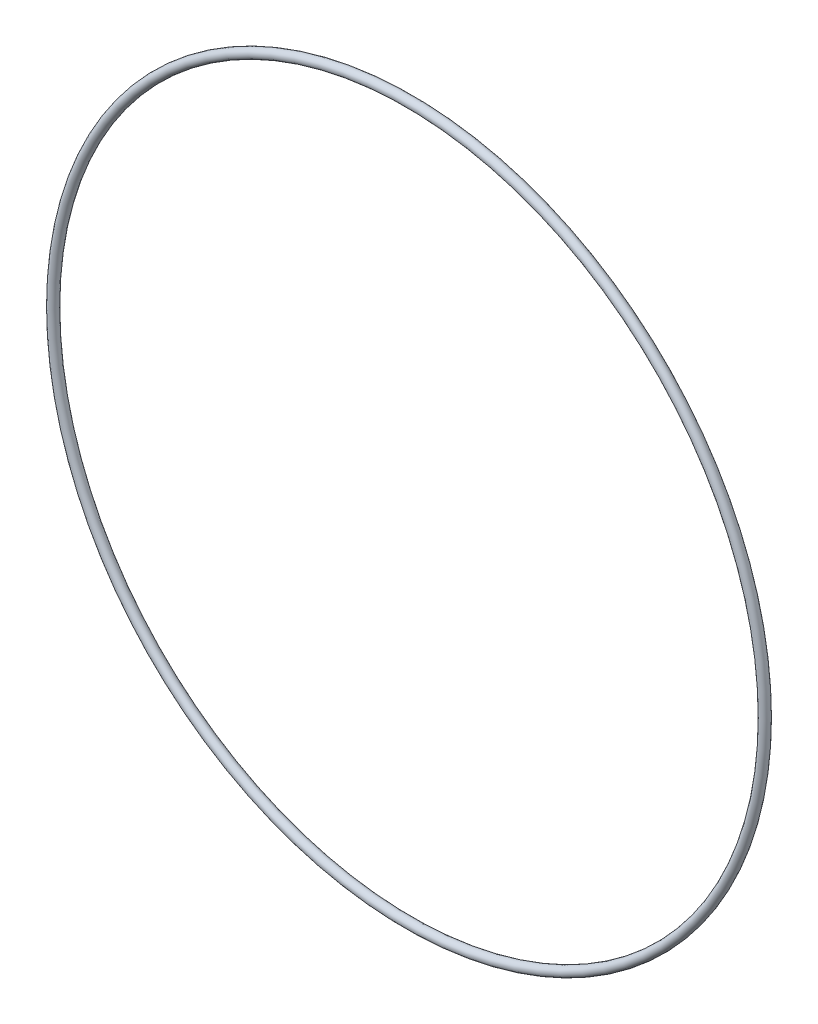
ISO-10303-21;
HEADER;
FILE_DESCRIPTION(('STEP AP214'),'2;1');
FILE_NAME('part.step','',(''),(''),'','','');
FILE_SCHEMA(('AUTOMOTIVE_DESIGN { 1 0 10303 214 1 1 1 1 }'));
ENDSEC;
DATA;
#1=APPLICATION_CONTEXT('core data for automotive mechanical design processes');
#2=APPLICATION_PROTOCOL_DEFINITION('international standard','automotive_design',2000,#1);
#3=PRODUCT_CONTEXT('',#1,'mechanical');
#4=PRODUCT('Part','Part','',(#3));
#5=PRODUCT_RELATED_PRODUCT_CATEGORY('part','',(#4));
#6=PRODUCT_DEFINITION_FORMATION('','',#4);
#7=PRODUCT_DEFINITION_CONTEXT('part definition',#1,'design');
#8=PRODUCT_DEFINITION('design','',#6,#7);
#9=PRODUCT_DEFINITION_SHAPE('','',#8);
#10=(LENGTH_UNIT() NAMED_UNIT(*) SI_UNIT(.MILLI.,.METRE.));
#11=(NAMED_UNIT(*) PLANE_ANGLE_UNIT() SI_UNIT($,.RADIAN.));
#12=(NAMED_UNIT(*) SI_UNIT($,.STERADIAN.) SOLID_ANGLE_UNIT());
#13=UNCERTAINTY_MEASURE_WITH_UNIT(LENGTH_MEASURE(1.E-05),#10,'distance_accuracy_value','');
#14=(GEOMETRIC_REPRESENTATION_CONTEXT(3) GLOBAL_UNCERTAINTY_ASSIGNED_CONTEXT((#13)) GLOBAL_UNIT_ASSIGNED_CONTEXT((#10,
#11,#12)) REPRESENTATION_CONTEXT('',''));
#15=CARTESIAN_POINT('',(0.,0.,0.));
#16=DIRECTION('',(0.,0.,1.));
#17=DIRECTION('',(1.,0.,0.));
#18=AXIS2_PLACEMENT_3D('',#15,#16,#17);
#19=CARTESIAN_POINT('',(0.,0.,0.));
#20=DIRECTION('',(0.,0.,1.));
#21=DIRECTION('',(1.,0.,0.));
#22=AXIS2_PLACEMENT_3D('',#19,#20,#21);
#23=TOROIDAL_SURFACE('',#22,67.4243,0.889000000000003);
#24=CARTESIAN_POINT('',(68.3133,0.,0.));
#25=VERTEX_POINT('',#24);
#26=VERTEX_LOOP('',#25);
#27=FACE_BOUND('',#26,.T.);
#28=ADVANCED_FACE('F28',(#27),#23,.T.);
#29=CLOSED_SHELL('',(#28));
#30=MANIFOLD_SOLID_BREP('B2',#29);
#31=ADVANCED_BREP_SHAPE_REPRESENTATION('',(#18,#30),#14);
#32=SHAPE_DEFINITION_REPRESENTATION(#9,#31);
ENDSEC;
END-ISO-10303-21;
